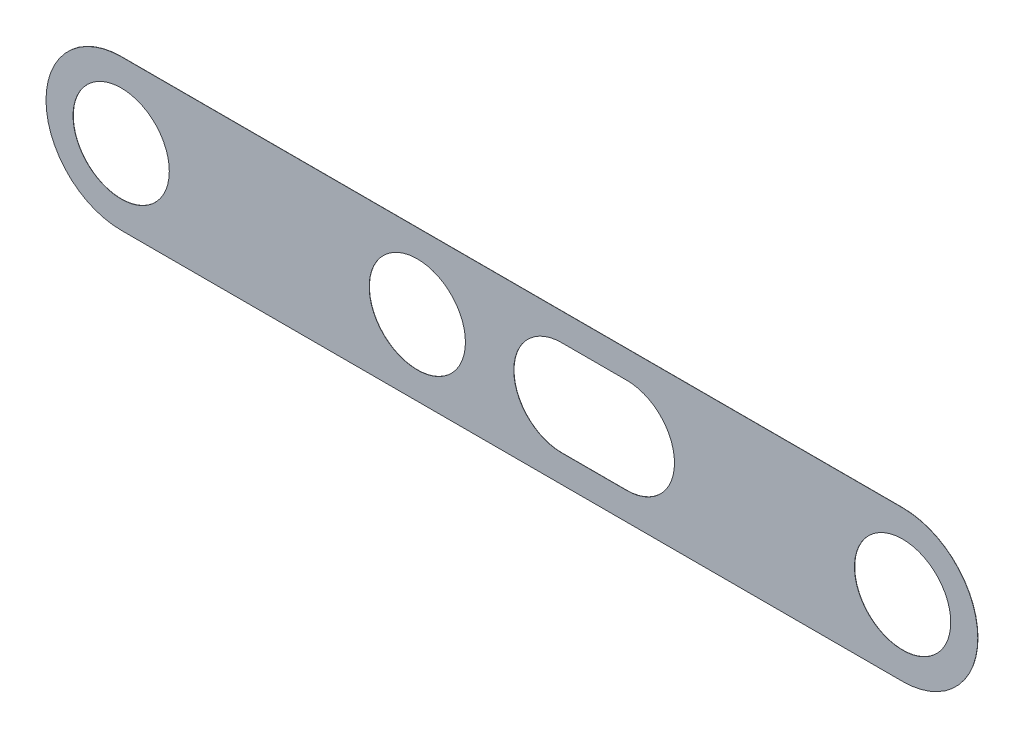
ISO-10303-21;
HEADER;
FILE_DESCRIPTION(('STEP AP214'),'2;1');
FILE_NAME('part.step','',(''),(''),'','','');
FILE_SCHEMA(('AUTOMOTIVE_DESIGN { 1 0 10303 214 1 1 1 1 }'));
ENDSEC;
DATA;
#1=APPLICATION_CONTEXT('core data for automotive mechanical design processes');
#2=APPLICATION_PROTOCOL_DEFINITION('international standard','automotive_design',2000,#1);
#3=PRODUCT_CONTEXT('',#1,'mechanical');
#4=PRODUCT('Part','Part','',(#3));
#5=PRODUCT_RELATED_PRODUCT_CATEGORY('part','',(#4));
#6=PRODUCT_DEFINITION_FORMATION('','',#4);
#7=PRODUCT_DEFINITION_CONTEXT('part definition',#1,'design');
#8=PRODUCT_DEFINITION('design','',#6,#7);
#9=PRODUCT_DEFINITION_SHAPE('','',#8);
#10=(LENGTH_UNIT() NAMED_UNIT(*) SI_UNIT(.MILLI.,.METRE.));
#11=(NAMED_UNIT(*) PLANE_ANGLE_UNIT() SI_UNIT($,.RADIAN.));
#12=(NAMED_UNIT(*) SI_UNIT($,.STERADIAN.) SOLID_ANGLE_UNIT());
#13=UNCERTAINTY_MEASURE_WITH_UNIT(LENGTH_MEASURE(1.E-05),#10,'distance_accuracy_value','');
#14=(GEOMETRIC_REPRESENTATION_CONTEXT(3) GLOBAL_UNCERTAINTY_ASSIGNED_CONTEXT((#13)) GLOBAL_UNIT_ASSIGNED_CONTEXT((#10,
#11,#12)) REPRESENTATION_CONTEXT('',''));
#15=CARTESIAN_POINT('',(0.,0.,0.));
#16=DIRECTION('',(0.,0.,1.));
#17=DIRECTION('',(1.,0.,0.));
#18=AXIS2_PLACEMENT_3D('',#15,#16,#17);
#19=CARTESIAN_POINT('',(0.,0.,-0.65));
#20=DIRECTION('',(0.,0.,1.));
#21=DIRECTION('',(1.,0.,0.));
#22=AXIS2_PLACEMENT_3D('',#19,#20,#21);
#23=PLANE('',#22);
#24=CARTESIAN_POINT('',(-47.5,0.,-0.65));
#25=DIRECTION('',(0.,0.,1.));
#26=DIRECTION('',(1.,0.,0.));
#27=AXIS2_PLACEMENT_3D('',#24,#25,#26);
#28=CIRCLE('',#27,5.85);
#29=CARTESIAN_POINT('',(-41.65,0.,-0.65));
#30=VERTEX_POINT('',#29);
#31=EDGE_CURVE('E128',#30,#30,#28,.F.);
#32=ORIENTED_EDGE('',*,*,#31,.T.);
#33=EDGE_LOOP('',(#32));
#34=FACE_BOUND('',#33,.T.);
#35=CARTESIAN_POINT('',(13.96785551477,0.,-0.65));
#36=DIRECTION('',(0.,0.,1.));
#37=DIRECTION('',(1.,0.,0.));
#38=AXIS2_PLACEMENT_3D('',#35,#36,#37);
#39=CIRCLE('',#38,5.8);
#40=CARTESIAN_POINT('',(13.96785551477,5.8,-0.65));
#41=VERTEX_POINT('',#40);
#42=CARTESIAN_POINT('',(13.96785551477,-5.8,-0.65));
#43=VERTEX_POINT('',#42);
#44=EDGE_CURVE('E131',#41,#43,#39,.F.);
#45=ORIENTED_EDGE('',*,*,#44,.T.);
#46=DIRECTION('',(1.,0.,0.));
#47=VECTOR('',#46,1.);
#48=CARTESIAN_POINT('',(13.96785551477,-5.8,-0.65));
#49=LINE('',#48,#47);
#50=CARTESIAN_POINT('',(6.032144485231,-5.8,-0.65));
#51=VERTEX_POINT('',#50);
#52=EDGE_CURVE('E107',#51,#43,#49,.T.);
#53=ORIENTED_EDGE('',*,*,#52,.F.);
#54=CARTESIAN_POINT('',(6.032144485231,0.,-0.65));
#55=DIRECTION('',(0.,0.,1.));
#56=DIRECTION('',(1.,0.,0.));
#57=AXIS2_PLACEMENT_3D('',#54,#55,#56);
#58=CIRCLE('',#57,5.8);
#59=CARTESIAN_POINT('',(6.032144485231,5.8,-0.65));
#60=VERTEX_POINT('',#59);
#61=EDGE_CURVE('E136',#51,#60,#58,.F.);
#62=ORIENTED_EDGE('',*,*,#61,.T.);
#63=DIRECTION('',(1.,0.,0.));
#64=VECTOR('',#63,1.);
#65=CARTESIAN_POINT('',(6.032144485231,5.8,-0.65));
#66=LINE('',#65,#64);
#67=EDGE_CURVE('E135',#41,#60,#66,.F.);
#68=ORIENTED_EDGE('',*,*,#67,.F.);
#69=EDGE_LOOP('',(#45,#53,#62,#68));
#70=FACE_BOUND('',#69,.T.);
#71=CARTESIAN_POINT('',(47.5,0.,-0.65));
#72=DIRECTION('',(0.,0.,1.));
#73=DIRECTION('',(1.,0.,0.));
#74=AXIS2_PLACEMENT_3D('',#71,#72,#73);
#75=CIRCLE('',#74,5.85);
#76=CARTESIAN_POINT('',(53.35,0.,-0.65));
#77=VERTEX_POINT('',#76);
#78=EDGE_CURVE('E103',#77,#77,#75,.F.);
#79=ORIENTED_EDGE('',*,*,#78,.T.);
#80=EDGE_LOOP('',(#79));
#81=FACE_BOUND('',#80,.T.);
#82=CARTESIAN_POINT('',(-11.5,0.,-0.65));
#83=DIRECTION('',(0.,0.,1.));
#84=DIRECTION('',(1.,0.,0.));
#85=AXIS2_PLACEMENT_3D('',#82,#83,#84);
#86=CIRCLE('',#85,5.85);
#87=CARTESIAN_POINT('',(-5.65,0.,-0.65));
#88=VERTEX_POINT('',#87);
#89=EDGE_CURVE('E100',#88,#88,#86,.F.);
#90=ORIENTED_EDGE('',*,*,#89,.T.);
#91=EDGE_LOOP('',(#90));
#92=FACE_BOUND('',#91,.T.);
#93=CARTESIAN_POINT('',(-47.5,0.,-0.65));
#94=DIRECTION('',(0.,0.,1.));
#95=DIRECTION('',(1.,0.,0.));
#96=AXIS2_PLACEMENT_3D('',#93,#94,#95);
#97=CIRCLE('',#96,9.14);
#98=CARTESIAN_POINT('',(-47.5,-9.14,-0.65));
#99=VERTEX_POINT('',#98);
#100=CARTESIAN_POINT('',(-47.5,9.14,-0.65));
#101=VERTEX_POINT('',#100);
#102=EDGE_CURVE('E20',#99,#101,#97,.F.);
#103=ORIENTED_EDGE('',*,*,#102,.F.);
#104=DIRECTION('',(1.,0.,0.));
#105=VECTOR('',#104,1.);
#106=CARTESIAN_POINT('',(-47.5,-9.14,-0.65));
#107=LINE('',#106,#105);
#108=CARTESIAN_POINT('',(47.5,-9.14,-0.65));
#109=VERTEX_POINT('',#108);
#110=EDGE_CURVE('E109',#109,#99,#107,.F.);
#111=ORIENTED_EDGE('',*,*,#110,.F.);
#112=CARTESIAN_POINT('',(47.5,0.,-0.65));
#113=DIRECTION('',(0.,0.,1.));
#114=DIRECTION('',(1.,0.,0.));
#115=AXIS2_PLACEMENT_3D('',#112,#113,#114);
#116=CIRCLE('',#115,9.14);
#117=CARTESIAN_POINT('',(47.5,9.14,-0.65));
#118=VERTEX_POINT('',#117);
#119=EDGE_CURVE('E99',#118,#109,#116,.F.);
#120=ORIENTED_EDGE('',*,*,#119,.F.);
#121=DIRECTION('',(1.,0.,0.));
#122=VECTOR('',#121,1.);
#123=CARTESIAN_POINT('',(47.5,9.14,-0.65));
#124=LINE('',#123,#122);
#125=EDGE_CURVE('E92',#101,#118,#124,.T.);
#126=ORIENTED_EDGE('',*,*,#125,.F.);
#127=EDGE_LOOP('',(#103,#111,#120,#126));
#128=FACE_BOUND('',#127,.T.);
#129=ADVANCED_FACE('F17',(#34,#70,#81,#92,#128),#23,.T.);
#130=CARTESIAN_POINT('',(-47.5,0.,-0.65));
#131=DIRECTION('',(0.,0.,1.));
#132=DIRECTION('',(1.,0.,0.));
#133=AXIS2_PLACEMENT_3D('',#130,#131,#132);
#134=CYLINDRICAL_SURFACE('',#133,9.14);
#135=DIRECTION('',(0.,0.,-1.));
#136=VECTOR('',#135,1.);
#137=CARTESIAN_POINT('',(-47.5,-9.14,-0.65));
#138=LINE('',#137,#136);
#139=CARTESIAN_POINT('',(-47.5,-9.14,-0.675));
#140=VERTEX_POINT('',#139);
#141=EDGE_CURVE('E84',#99,#140,#138,.T.);
#142=ORIENTED_EDGE('',*,*,#141,.F.);
#143=ORIENTED_EDGE('',*,*,#102,.T.);
#144=DIRECTION('',(0.,0.,1.));
#145=VECTOR('',#144,1.);
#146=CARTESIAN_POINT('',(-47.5,9.14,-0.65));
#147=LINE('',#146,#145);
#148=CARTESIAN_POINT('',(-47.5,9.14,-0.675));
#149=VERTEX_POINT('',#148);
#150=EDGE_CURVE('E81',#149,#101,#147,.T.);
#151=ORIENTED_EDGE('',*,*,#150,.F.);
#152=CARTESIAN_POINT('',(-47.5,0.,-0.675));
#153=DIRECTION('',(0.,0.,1.));
#154=DIRECTION('',(1.,0.,0.));
#155=AXIS2_PLACEMENT_3D('',#152,#153,#154);
#156=CIRCLE('',#155,9.14);
#157=EDGE_CURVE('E126',#149,#140,#156,.T.);
#158=ORIENTED_EDGE('',*,*,#157,.T.);
#159=EDGE_LOOP('',(#142,#143,#151,#158));
#160=FACE_BOUND('',#159,.T.);
#161=ADVANCED_FACE('F80',(#160),#134,.T.);
#162=CARTESIAN_POINT('',(-47.5,-9.14,-0.65));
#163=DIRECTION('',(0.,-1.,0.));
#164=DIRECTION('',(0.,0.,-1.));
#165=AXIS2_PLACEMENT_3D('',#162,#163,#164);
#166=PLANE('',#165);
#167=DIRECTION('',(0.,0.,1.));
#168=VECTOR('',#167,1.);
#169=CARTESIAN_POINT('',(47.5,-9.14,-0.65));
#170=LINE('',#169,#168);
#171=CARTESIAN_POINT('',(47.5,-9.14,-0.675));
#172=VERTEX_POINT('',#171);
#173=EDGE_CURVE('E110',#109,#172,#170,.F.);
#174=ORIENTED_EDGE('',*,*,#173,.F.);
#175=ORIENTED_EDGE('',*,*,#110,.T.);
#176=ORIENTED_EDGE('',*,*,#141,.T.);
#177=DIRECTION('',(1.,0.,0.));
#178=VECTOR('',#177,1.);
#179=CARTESIAN_POINT('',(0.,-9.14,-0.675));
#180=LINE('',#179,#178);
#181=EDGE_CURVE('E125',#140,#172,#180,.T.);
#182=ORIENTED_EDGE('',*,*,#181,.T.);
#183=EDGE_LOOP('',(#174,#175,#176,#182));
#184=FACE_BOUND('',#183,.T.);
#185=ADVANCED_FACE('F273',(#184),#166,.T.);
#186=CARTESIAN_POINT('',(47.5,0.,-0.65));
#187=DIRECTION('',(0.,0.,1.));
#188=DIRECTION('',(1.,0.,0.));
#189=AXIS2_PLACEMENT_3D('',#186,#187,#188);
#190=CYLINDRICAL_SURFACE('',#189,9.14);
#191=DIRECTION('',(0.,0.,1.));
#192=VECTOR('',#191,1.);
#193=CARTESIAN_POINT('',(47.5,9.14,-0.65));
#194=LINE('',#193,#192);
#195=CARTESIAN_POINT('',(47.5,9.14,-0.675));
#196=VERTEX_POINT('',#195);
#197=EDGE_CURVE('E96',#118,#196,#194,.F.);
#198=ORIENTED_EDGE('',*,*,#197,.F.);
#199=ORIENTED_EDGE('',*,*,#119,.T.);
#200=ORIENTED_EDGE('',*,*,#173,.T.);
#201=CARTESIAN_POINT('',(47.5,0.,-0.675));
#202=DIRECTION('',(0.,0.,1.));
#203=DIRECTION('',(1.,0.,0.));
#204=AXIS2_PLACEMENT_3D('',#201,#202,#203);
#205=CIRCLE('',#204,9.14);
#206=EDGE_CURVE('E123',#172,#196,#205,.T.);
#207=ORIENTED_EDGE('',*,*,#206,.T.);
#208=EDGE_LOOP('',(#198,#199,#200,#207));
#209=FACE_BOUND('',#208,.T.);
#210=ADVANCED_FACE('F265',(#209),#190,.T.);
#211=CARTESIAN_POINT('',(47.5,9.14,-0.65));
#212=DIRECTION('',(0.,1.,0.));
#213=DIRECTION('',(0.,0.,1.));
#214=AXIS2_PLACEMENT_3D('',#211,#212,#213);
#215=PLANE('',#214);
#216=ORIENTED_EDGE('',*,*,#150,.T.);
#217=ORIENTED_EDGE('',*,*,#125,.T.);
#218=ORIENTED_EDGE('',*,*,#197,.T.);
#219=DIRECTION('',(1.,0.,0.));
#220=VECTOR('',#219,1.);
#221=CARTESIAN_POINT('',(0.,9.14,-0.675));
#222=LINE('',#221,#220);
#223=EDGE_CURVE('E95',#196,#149,#222,.F.);
#224=ORIENTED_EDGE('',*,*,#223,.T.);
#225=EDGE_LOOP('',(#216,#217,#218,#224));
#226=FACE_BOUND('',#225,.T.);
#227=ADVANCED_FACE('F90',(#226),#215,.T.);
#228=CARTESIAN_POINT('',(-11.5,0.,-0.65));
#229=DIRECTION('',(0.,0.,1.));
#230=DIRECTION('',(1.,0.,0.));
#231=AXIS2_PLACEMENT_3D('',#228,#229,#230);
#232=CYLINDRICAL_SURFACE('',#231,5.85);
#233=CARTESIAN_POINT('',(-11.5,0.,-0.675));
#234=DIRECTION('',(0.,0.,1.));
#235=DIRECTION('',(1.,0.,0.));
#236=AXIS2_PLACEMENT_3D('',#233,#234,#235);
#237=CIRCLE('',#236,5.85);
#238=CARTESIAN_POINT('',(-5.65,0.,-0.675));
#239=VERTEX_POINT('',#238);
#240=EDGE_CURVE('E120',#239,#239,#237,.F.);
#241=ORIENTED_EDGE('',*,*,#240,.T.);
#242=EDGE_LOOP('',(#241));
#243=FACE_BOUND('',#242,.T.);
#244=ORIENTED_EDGE('',*,*,#89,.F.);
#245=EDGE_LOOP('',(#244));
#246=FACE_BOUND('',#245,.T.);
#247=ADVANCED_FACE('F190',(#243,#246),#232,.F.);
#248=CARTESIAN_POINT('',(47.5,0.,-0.65));
#249=DIRECTION('',(0.,0.,1.));
#250=DIRECTION('',(1.,0.,0.));
#251=AXIS2_PLACEMENT_3D('',#248,#249,#250);
#252=CYLINDRICAL_SURFACE('',#251,5.85);
#253=CARTESIAN_POINT('',(47.5,0.,-0.675));
#254=DIRECTION('',(0.,0.,1.));
#255=DIRECTION('',(1.,0.,0.));
#256=AXIS2_PLACEMENT_3D('',#253,#254,#255);
#257=CIRCLE('',#256,5.85);
#258=CARTESIAN_POINT('',(53.35,0.,-0.675));
#259=VERTEX_POINT('',#258);
#260=EDGE_CURVE('E117',#259,#259,#257,.F.);
#261=ORIENTED_EDGE('',*,*,#260,.T.);
#262=EDGE_LOOP('',(#261));
#263=FACE_BOUND('',#262,.T.);
#264=ORIENTED_EDGE('',*,*,#78,.F.);
#265=EDGE_LOOP('',(#264));
#266=FACE_BOUND('',#265,.T.);
#267=ADVANCED_FACE('F182',(#263,#266),#252,.F.);
#268=CARTESIAN_POINT('',(13.96785551477,-5.8,-0.65));
#269=DIRECTION('',(0.,1.,0.));
#270=DIRECTION('',(0.,0.,1.));
#271=AXIS2_PLACEMENT_3D('',#268,#269,#270);
#272=PLANE('',#271);
#273=DIRECTION('',(0.,0.,1.));
#274=VECTOR('',#273,1.);
#275=CARTESIAN_POINT('',(6.032144485231,-5.8,-0.65));
#276=LINE('',#275,#274);
#277=CARTESIAN_POINT('',(6.032144485231,-5.8,-0.675));
#278=VERTEX_POINT('',#277);
#279=EDGE_CURVE('E138',#278,#51,#276,.T.);
#280=ORIENTED_EDGE('',*,*,#279,.T.);
#281=ORIENTED_EDGE('',*,*,#52,.T.);
#282=DIRECTION('',(0.,0.,1.));
#283=VECTOR('',#282,1.);
#284=CARTESIAN_POINT('',(13.96785551477,-5.8,-0.65));
#285=LINE('',#284,#283);
#286=CARTESIAN_POINT('',(13.96785551477,-5.8,-0.675));
#287=VERTEX_POINT('',#286);
#288=EDGE_CURVE('E134',#43,#287,#285,.F.);
#289=ORIENTED_EDGE('',*,*,#288,.T.);
#290=DIRECTION('',(1.,0.,0.));
#291=VECTOR('',#290,1.);
#292=CARTESIAN_POINT('',(0.,-5.8,-0.675));
#293=LINE('',#292,#291);
#294=EDGE_CURVE('E116',#287,#278,#293,.F.);
#295=ORIENTED_EDGE('',*,*,#294,.T.);
#296=EDGE_LOOP('',(#280,#281,#289,#295));
#297=FACE_BOUND('',#296,.T.);
#298=ADVANCED_FACE('F180',(#297),#272,.T.);
#299=CARTESIAN_POINT('',(6.032144485231,0.,-0.65));
#300=DIRECTION('',(0.,0.,1.));
#301=DIRECTION('',(1.,0.,0.));
#302=AXIS2_PLACEMENT_3D('',#299,#300,#301);
#303=CYLINDRICAL_SURFACE('',#302,5.8);
#304=CARTESIAN_POINT('',(6.032144485231,0.,-0.675));
#305=DIRECTION('',(0.,0.,1.));
#306=DIRECTION('',(1.,0.,0.));
#307=AXIS2_PLACEMENT_3D('',#304,#305,#306);
#308=CIRCLE('',#307,5.8);
#309=CARTESIAN_POINT('',(6.032144485231,5.8,-0.675));
#310=VERTEX_POINT('',#309);
#311=EDGE_CURVE('E114',#278,#310,#308,.F.);
#312=ORIENTED_EDGE('',*,*,#311,.T.);
#313=DIRECTION('',(0.,0.,-1.));
#314=VECTOR('',#313,1.);
#315=CARTESIAN_POINT('',(6.032144485231,5.8,-0.65));
#316=LINE('',#315,#314);
#317=EDGE_CURVE('E147',#60,#310,#316,.T.);
#318=ORIENTED_EDGE('',*,*,#317,.F.);
#319=ORIENTED_EDGE('',*,*,#61,.F.);
#320=ORIENTED_EDGE('',*,*,#279,.F.);
#321=EDGE_LOOP('',(#312,#318,#319,#320));
#322=FACE_BOUND('',#321,.T.);
#323=ADVANCED_FACE('F179',(#322),#303,.F.);
#324=CARTESIAN_POINT('',(6.032144485231,5.8,-0.65));
#325=DIRECTION('',(0.,-1.,0.));
#326=DIRECTION('',(0.,0.,-1.));
#327=AXIS2_PLACEMENT_3D('',#324,#325,#326);
#328=PLANE('',#327);
#329=DIRECTION('',(0.,0.,1.));
#330=VECTOR('',#329,1.);
#331=CARTESIAN_POINT('',(13.96785551477,5.8,-0.65));
#332=LINE('',#331,#330);
#333=CARTESIAN_POINT('',(13.96785551477,5.8,-0.675));
#334=VERTEX_POINT('',#333);
#335=EDGE_CURVE('E35',#334,#41,#332,.T.);
#336=ORIENTED_EDGE('',*,*,#335,.T.);
#337=ORIENTED_EDGE('',*,*,#67,.T.);
#338=ORIENTED_EDGE('',*,*,#317,.T.);
#339=DIRECTION('',(1.,0.,0.));
#340=VECTOR('',#339,1.);
#341=CARTESIAN_POINT('',(0.,5.8,-0.675));
#342=LINE('',#341,#340);
#343=EDGE_CURVE('E113',#310,#334,#342,.T.);
#344=ORIENTED_EDGE('',*,*,#343,.T.);
#345=EDGE_LOOP('',(#336,#337,#338,#344));
#346=FACE_BOUND('',#345,.T.);
#347=ADVANCED_FACE('F166',(#346),#328,.T.);
#348=CARTESIAN_POINT('',(13.96785551477,0.,-0.65));
#349=DIRECTION('',(0.,0.,1.));
#350=DIRECTION('',(1.,0.,0.));
#351=AXIS2_PLACEMENT_3D('',#348,#349,#350);
#352=CYLINDRICAL_SURFACE('',#351,5.8);
#353=CARTESIAN_POINT('',(13.96785551477,0.,-0.675));
#354=DIRECTION('',(0.,0.,1.));
#355=DIRECTION('',(1.,0.,0.));
#356=AXIS2_PLACEMENT_3D('',#353,#354,#355);
#357=CIRCLE('',#356,5.8);
#358=EDGE_CURVE('E26',#334,#287,#357,.F.);
#359=ORIENTED_EDGE('',*,*,#358,.T.);
#360=ORIENTED_EDGE('',*,*,#288,.F.);
#361=ORIENTED_EDGE('',*,*,#44,.F.);
#362=ORIENTED_EDGE('',*,*,#335,.F.);
#363=EDGE_LOOP('',(#359,#360,#361,#362));
#364=FACE_BOUND('',#363,.T.);
#365=ADVANCED_FACE('F173',(#364),#352,.F.);
#366=CARTESIAN_POINT('',(-47.5,0.,-0.65));
#367=DIRECTION('',(0.,0.,1.));
#368=DIRECTION('',(1.,0.,0.));
#369=AXIS2_PLACEMENT_3D('',#366,#367,#368);
#370=CYLINDRICAL_SURFACE('',#369,5.85);
#371=CARTESIAN_POINT('',(-47.5,0.,-0.675));
#372=DIRECTION('',(0.,0.,1.));
#373=DIRECTION('',(1.,0.,0.));
#374=AXIS2_PLACEMENT_3D('',#371,#372,#373);
#375=CIRCLE('',#374,5.85);
#376=CARTESIAN_POINT('',(-41.65,0.,-0.675));
#377=VERTEX_POINT('',#376);
#378=EDGE_CURVE('E11',#377,#377,#375,.F.);
#379=ORIENTED_EDGE('',*,*,#378,.T.);
#380=EDGE_LOOP('',(#379));
#381=FACE_BOUND('',#380,.T.);
#382=ORIENTED_EDGE('',*,*,#31,.F.);
#383=EDGE_LOOP('',(#382));
#384=FACE_BOUND('',#383,.T.);
#385=ADVANCED_FACE('F194',(#381,#384),#370,.F.);
#386=CARTESIAN_POINT('',(0.,0.,-0.675));
#387=DIRECTION('',(0.,0.,1.));
#388=DIRECTION('',(1.,0.,0.));
#389=AXIS2_PLACEMENT_3D('',#386,#387,#388);
#390=PLANE('',#389);
#391=ORIENTED_EDGE('',*,*,#378,.F.);
#392=EDGE_LOOP('',(#391));
#393=FACE_BOUND('',#392,.T.);
#394=ORIENTED_EDGE('',*,*,#358,.F.);
#395=ORIENTED_EDGE('',*,*,#343,.F.);
#396=ORIENTED_EDGE('',*,*,#311,.F.);
#397=ORIENTED_EDGE('',*,*,#294,.F.);
#398=EDGE_LOOP('',(#394,#395,#396,#397));
#399=FACE_BOUND('',#398,.T.);
#400=ORIENTED_EDGE('',*,*,#260,.F.);
#401=EDGE_LOOP('',(#400));
#402=FACE_BOUND('',#401,.T.);
#403=ORIENTED_EDGE('',*,*,#240,.F.);
#404=EDGE_LOOP('',(#403));
#405=FACE_BOUND('',#404,.T.);
#406=ORIENTED_EDGE('',*,*,#223,.F.);
#407=ORIENTED_EDGE('',*,*,#206,.F.);
#408=ORIENTED_EDGE('',*,*,#181,.F.);
#409=ORIENTED_EDGE('',*,*,#157,.F.);
#410=EDGE_LOOP('',(#406,#407,#408,#409));
#411=FACE_BOUND('',#410,.T.);
#412=ADVANCED_FACE('F169',(#393,#399,#402,#405,#411),#390,.F.);
#413=CLOSED_SHELL('',(#129,#161,#185,#210,#227,#247,#267,#298,#323,#347,#365,#385,#412));
#414=MANIFOLD_SOLID_BREP('B1',#413);
#415=ADVANCED_BREP_SHAPE_REPRESENTATION('',(#18,#414),#14);
#416=SHAPE_DEFINITION_REPRESENTATION(#9,#415);
ENDSEC;
END-ISO-10303-21;
